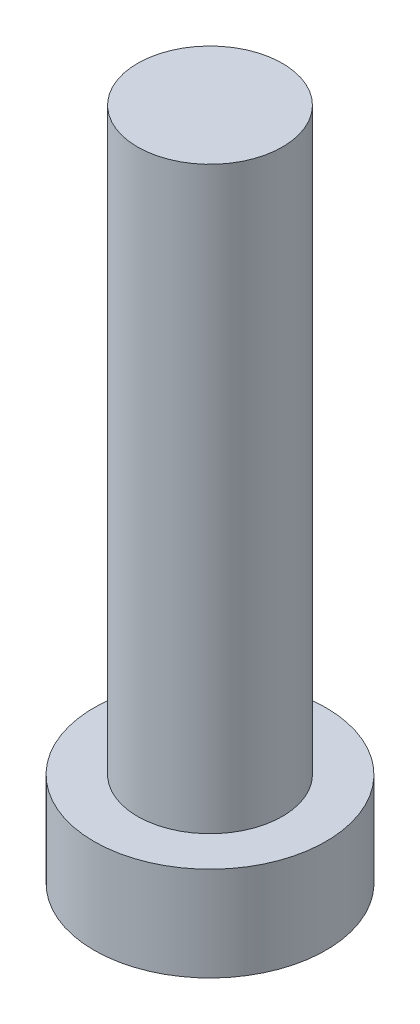
ISO-10303-21;
HEADER;
FILE_DESCRIPTION(('STEP AP214'),'2;1');
FILE_NAME('part.step','',(''),(''),'','','');
FILE_SCHEMA(('AUTOMOTIVE_DESIGN { 1 0 10303 214 1 1 1 1 }'));
ENDSEC;
DATA;
#1=APPLICATION_CONTEXT('core data for automotive mechanical design processes');
#2=APPLICATION_PROTOCOL_DEFINITION('international standard','automotive_design',2000,#1);
#3=PRODUCT_CONTEXT('',#1,'mechanical');
#4=PRODUCT('Part','Part','',(#3));
#5=PRODUCT_RELATED_PRODUCT_CATEGORY('part','',(#4));
#6=PRODUCT_DEFINITION_FORMATION('','',#4);
#7=PRODUCT_DEFINITION_CONTEXT('part definition',#1,'design');
#8=PRODUCT_DEFINITION('design','',#6,#7);
#9=PRODUCT_DEFINITION_SHAPE('','',#8);
#10=(LENGTH_UNIT() NAMED_UNIT(*) SI_UNIT(.MILLI.,.METRE.));
#11=(NAMED_UNIT(*) PLANE_ANGLE_UNIT() SI_UNIT($,.RADIAN.));
#12=(NAMED_UNIT(*) SI_UNIT($,.STERADIAN.) SOLID_ANGLE_UNIT());
#13=UNCERTAINTY_MEASURE_WITH_UNIT(LENGTH_MEASURE(1.E-05),#10,'distance_accuracy_value','');
#14=(GEOMETRIC_REPRESENTATION_CONTEXT(3) GLOBAL_UNCERTAINTY_ASSIGNED_CONTEXT((#13)) GLOBAL_UNIT_ASSIGNED_CONTEXT((#10,
#11,#12)) REPRESENTATION_CONTEXT('',''));
#15=CARTESIAN_POINT('',(0.,0.,0.));
#16=DIRECTION('',(0.,0.,1.));
#17=DIRECTION('',(1.,0.,0.));
#18=AXIS2_PLACEMENT_3D('',#15,#16,#17);
#19=CARTESIAN_POINT('',(0.,1.3,0.));
#20=DIRECTION('',(0.,-1.,0.));
#21=DIRECTION('',(0.,0.,-1.));
#22=AXIS2_PLACEMENT_3D('',#19,#20,#21);
#23=CYLINDRICAL_SURFACE('',#22,1.6);
#24=CARTESIAN_POINT('',(0.,1.3,0.));
#25=DIRECTION('',(0.,1.,0.));
#26=DIRECTION('',(0.,0.,1.));
#27=AXIS2_PLACEMENT_3D('',#24,#25,#26);
#28=CIRCLE('',#27,1.6);
#29=CARTESIAN_POINT('',(0.,1.3,1.6));
#30=VERTEX_POINT('',#29);
#31=EDGE_CURVE('E40',#30,#30,#28,.T.);
#32=ORIENTED_EDGE('',*,*,#31,.F.);
#33=EDGE_LOOP('',(#32));
#34=FACE_BOUND('',#33,.T.);
#35=CARTESIAN_POINT('',(0.,0.,0.));
#36=DIRECTION('',(0.,1.,0.));
#37=DIRECTION('',(0.,0.,1.));
#38=AXIS2_PLACEMENT_3D('',#35,#36,#37);
#39=CIRCLE('',#38,1.6);
#40=CARTESIAN_POINT('',(0.,0.,1.6));
#41=VERTEX_POINT('',#40);
#42=EDGE_CURVE('E36',#41,#41,#39,.T.);
#43=ORIENTED_EDGE('',*,*,#42,.T.);
#44=EDGE_LOOP('',(#43));
#45=FACE_BOUND('',#44,.T.);
#46=ADVANCED_FACE('F33',(#34,#45),#23,.T.);
#47=CARTESIAN_POINT('',(0.,1.3,0.));
#48=DIRECTION('',(0.,1.,0.));
#49=DIRECTION('',(0.,0.,1.));
#50=AXIS2_PLACEMENT_3D('',#47,#48,#49);
#51=PLANE('',#50);
#52=CARTESIAN_POINT('',(0.,1.3,0.));
#53=DIRECTION('',(0.,1.,0.));
#54=DIRECTION('',(0.,0.,1.));
#55=AXIS2_PLACEMENT_3D('',#52,#53,#54);
#56=CIRCLE('',#55,1.);
#57=CARTESIAN_POINT('',(0.,1.3,1.));
#58=VERTEX_POINT('',#57);
#59=EDGE_CURVE('E10',#58,#58,#56,.T.);
#60=ORIENTED_EDGE('',*,*,#59,.F.);
#61=EDGE_LOOP('',(#60));
#62=FACE_BOUND('',#61,.T.);
#63=ORIENTED_EDGE('',*,*,#31,.T.);
#64=EDGE_LOOP('',(#63));
#65=FACE_BOUND('',#64,.T.);
#66=ADVANCED_FACE('F57',(#62,#65),#51,.T.);
#67=CARTESIAN_POINT('',(0.,0.,0.));
#68=DIRECTION('',(0.,1.,0.));
#69=DIRECTION('',(0.,0.,1.));
#70=AXIS2_PLACEMENT_3D('',#67,#68,#69);
#71=PLANE('',#70);
#72=ORIENTED_EDGE('',*,*,#42,.F.);
#73=EDGE_LOOP('',(#72));
#74=FACE_BOUND('',#73,.T.);
#75=ADVANCED_FACE('F54',(#74),#71,.F.);
#76=CARTESIAN_POINT('',(0.,9.3,0.));
#77=DIRECTION('',(0.,-1.,0.));
#78=DIRECTION('',(0.,0.,-1.));
#79=AXIS2_PLACEMENT_3D('',#76,#77,#78);
#80=CYLINDRICAL_SURFACE('',#79,1.);
#81=CARTESIAN_POINT('',(0.,9.3,0.));
#82=DIRECTION('',(0.,1.,0.));
#83=DIRECTION('',(0.,0.,1.));
#84=AXIS2_PLACEMENT_3D('',#81,#82,#83);
#85=CIRCLE('',#84,1.);
#86=CARTESIAN_POINT('',(0.,9.3,1.));
#87=VERTEX_POINT('',#86);
#88=EDGE_CURVE('E46',#87,#87,#85,.T.);
#89=ORIENTED_EDGE('',*,*,#88,.F.);
#90=EDGE_LOOP('',(#89));
#91=FACE_BOUND('',#90,.T.);
#92=ORIENTED_EDGE('',*,*,#59,.T.);
#93=EDGE_LOOP('',(#92));
#94=FACE_BOUND('',#93,.T.);
#95=ADVANCED_FACE('F56',(#91,#94),#80,.T.);
#96=CARTESIAN_POINT('',(0.,9.3,0.));
#97=DIRECTION('',(0.,1.,0.));
#98=DIRECTION('',(0.,0.,1.));
#99=AXIS2_PLACEMENT_3D('',#96,#97,#98);
#100=PLANE('',#99);
#101=ORIENTED_EDGE('',*,*,#88,.T.);
#102=EDGE_LOOP('',(#101));
#103=FACE_BOUND('',#102,.T.);
#104=ADVANCED_FACE('F62',(#103),#100,.T.);
#105=CLOSED_SHELL('',(#46,#66,#75,#95,#104));
#106=MANIFOLD_SOLID_BREP('B2',#105);
#107=ADVANCED_BREP_SHAPE_REPRESENTATION('',(#18,#106),#14);
#108=SHAPE_DEFINITION_REPRESENTATION(#9,#107);
ENDSEC;
END-ISO-10303-21;
